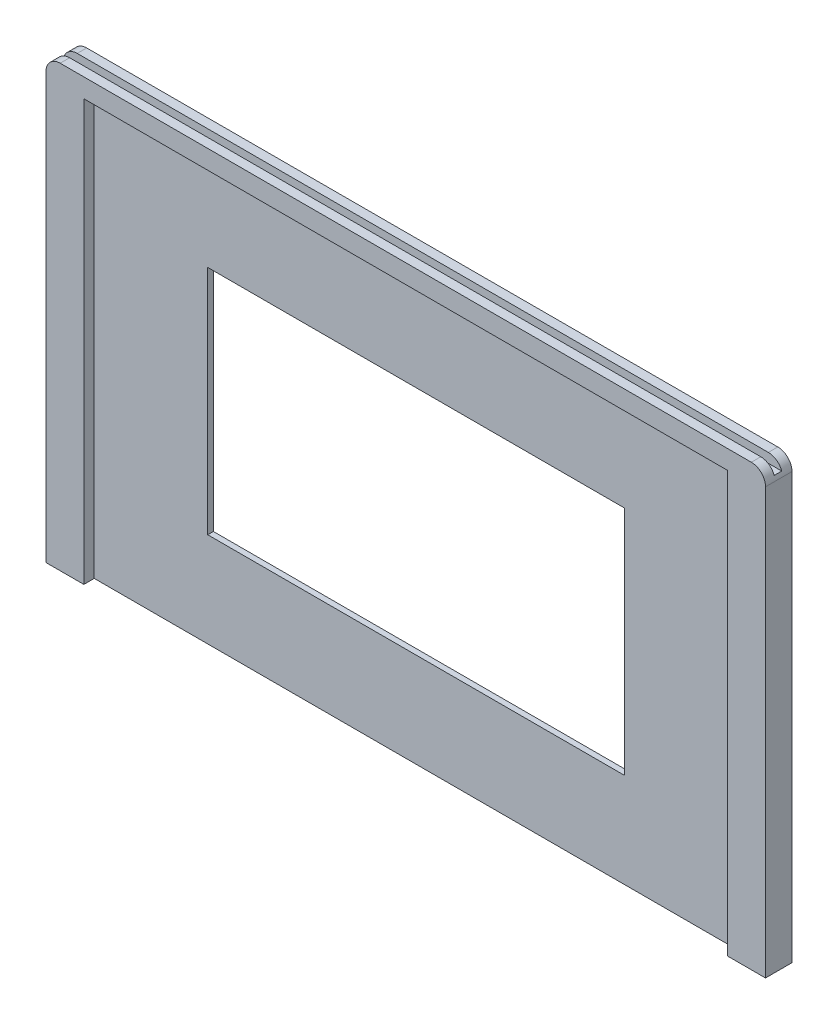
ISO-10303-21;
HEADER;
FILE_DESCRIPTION(('STEP AP214'),'2;1');
FILE_NAME('part.step','',(''),(''),'','','');
FILE_SCHEMA(('AUTOMOTIVE_DESIGN { 1 0 10303 214 1 1 1 1 }'));
ENDSEC;
DATA;
#1=APPLICATION_CONTEXT('core data for automotive mechanical design processes');
#2=APPLICATION_PROTOCOL_DEFINITION('international standard','automotive_design',2000,#1);
#3=PRODUCT_CONTEXT('',#1,'mechanical');
#4=PRODUCT('Part','Part','',(#3));
#5=PRODUCT_RELATED_PRODUCT_CATEGORY('part','',(#4));
#6=PRODUCT_DEFINITION_FORMATION('','',#4);
#7=PRODUCT_DEFINITION_CONTEXT('part definition',#1,'design');
#8=PRODUCT_DEFINITION('design','',#6,#7);
#9=PRODUCT_DEFINITION_SHAPE('','',#8);
#10=(LENGTH_UNIT() NAMED_UNIT(*) SI_UNIT(.MILLI.,.METRE.));
#11=(NAMED_UNIT(*) PLANE_ANGLE_UNIT() SI_UNIT($,.RADIAN.));
#12=(NAMED_UNIT(*) SI_UNIT($,.STERADIAN.) SOLID_ANGLE_UNIT());
#13=UNCERTAINTY_MEASURE_WITH_UNIT(LENGTH_MEASURE(1.E-05),#10,'distance_accuracy_value','');
#14=(GEOMETRIC_REPRESENTATION_CONTEXT(3) GLOBAL_UNCERTAINTY_ASSIGNED_CONTEXT((#13)) GLOBAL_UNIT_ASSIGNED_CONTEXT((#10,
#11,#12)) REPRESENTATION_CONTEXT('',''));
#15=CARTESIAN_POINT('',(0.,0.,0.));
#16=DIRECTION('',(0.,0.,1.));
#17=DIRECTION('',(1.,0.,0.));
#18=AXIS2_PLACEMENT_3D('',#15,#16,#17);
#19=CARTESIAN_POINT('',(-91.35,69.4698383459283,7.));
#20=DIRECTION('',(0.,-1.,0.));
#21=DIRECTION('',(1.,0.,0.));
#22=AXIS2_PLACEMENT_3D('',#19,#20,#21);
#23=PLANE('',#22);
#24=DIRECTION('',(0.,0.,-1.));
#25=VECTOR('',#24,1.);
#26=CARTESIAN_POINT('',(-91.35,69.4698383459283,7.));
#27=LINE('',#26,#25);
#28=CARTESIAN_POINT('',(-91.3499999999999,69.4698383459283,2.50000000000003));
#29=VERTEX_POINT('',#28);
#30=CARTESIAN_POINT('',(-91.35,69.4698383459283,0.));
#31=VERTEX_POINT('',#30);
#32=EDGE_CURVE('E390',#29,#31,#27,.T.);
#33=ORIENTED_EDGE('',*,*,#32,.F.);
#34=DIRECTION('',(-1.,0.,0.));
#35=VECTOR('',#34,1.);
#36=CARTESIAN_POINT('',(95.1,69.4698383459283,2.49999999999996));
#37=LINE('',#36,#35);
#38=CARTESIAN_POINT('',(91.35,69.4698383459283,2.49999999999997));
#39=VERTEX_POINT('',#38);
#40=EDGE_CURVE('E237',#39,#29,#37,.T.);
#41=ORIENTED_EDGE('',*,*,#40,.F.);
#42=DIRECTION('',(0.,0.,-1.));
#43=VECTOR('',#42,1.);
#44=CARTESIAN_POINT('',(91.35,69.4698383459283,7.));
#45=LINE('',#44,#43);
#46=CARTESIAN_POINT('',(91.35,69.4698383459283,0.));
#47=VERTEX_POINT('',#46);
#48=EDGE_CURVE('E395',#39,#47,#45,.T.);
#49=ORIENTED_EDGE('',*,*,#48,.T.);
#50=DIRECTION('',(-1.,0.,0.));
#51=VECTOR('',#50,1.);
#52=CARTESIAN_POINT('',(-91.35,69.4698383459283,0.));
#53=LINE('',#52,#51);
#54=EDGE_CURVE('E373',#47,#31,#53,.T.);
#55=ORIENTED_EDGE('',*,*,#54,.T.);
#56=EDGE_LOOP('',(#33,#41,#49,#55));
#57=FACE_BOUND('',#56,.T.);
#58=ADVANCED_FACE('F39',(#57),#23,.F.);
#59=CARTESIAN_POINT('',(-95.1,-46.7301616540717,7.));
#60=DIRECTION('',(0.,1.,0.));
#61=DIRECTION('',(-1.,0.,0.));
#62=AXIS2_PLACEMENT_3D('',#59,#60,#61);
#63=PLANE('',#62);
#64=DIRECTION('',(1.,0.,0.));
#65=VECTOR('',#64,1.);
#66=CARTESIAN_POINT('',(-85.1,-46.7301616540717,4.25));
#67=LINE('',#66,#65);
#68=CARTESIAN_POINT('',(-85.1,-46.7301616540717,4.25));
#69=VERTEX_POINT('',#68);
#70=CARTESIAN_POINT('',(85.1,-46.7301616540717,4.25));
#71=VERTEX_POINT('',#70);
#72=EDGE_CURVE('E262',#69,#71,#67,.T.);
#73=ORIENTED_EDGE('',*,*,#72,.F.);
#74=DIRECTION('',(0.,0.,1.));
#75=VECTOR('',#74,1.);
#76=CARTESIAN_POINT('',(-85.1,-46.7301616540717,4.25));
#77=LINE('',#76,#75);
#78=CARTESIAN_POINT('',(-85.1,-46.7301616540717,7.));
#79=VERTEX_POINT('',#78);
#80=EDGE_CURVE('E287',#69,#79,#77,.T.);
#81=ORIENTED_EDGE('',*,*,#80,.T.);
#82=DIRECTION('',(1.,0.,0.));
#83=VECTOR('',#82,1.);
#84=CARTESIAN_POINT('',(-95.1,-46.7301616540717,7.));
#85=LINE('',#84,#83);
#86=CARTESIAN_POINT('',(-95.1,-46.7301616540717,7.));
#87=VERTEX_POINT('',#86);
#88=EDGE_CURVE('E341',#87,#79,#85,.T.);
#89=ORIENTED_EDGE('',*,*,#88,.F.);
#90=DIRECTION('',(0.,0.,-1.));
#91=VECTOR('',#90,1.);
#92=CARTESIAN_POINT('',(-95.1,-46.7301616540717,7.));
#93=LINE('',#92,#91);
#94=CARTESIAN_POINT('',(-95.1,-46.7301616540717,0.));
#95=VERTEX_POINT('',#94);
#96=EDGE_CURVE('E361',#87,#95,#93,.T.);
#97=ORIENTED_EDGE('',*,*,#96,.T.);
#98=DIRECTION('',(1.,0.,0.));
#99=VECTOR('',#98,1.);
#100=CARTESIAN_POINT('',(-95.1,-46.7301616540717,0.));
#101=LINE('',#100,#99);
#102=CARTESIAN_POINT('',(-85.1,-46.7301616540717,0.));
#103=VERTEX_POINT('',#102);
#104=EDGE_CURVE('E362',#95,#103,#101,.T.);
#105=ORIENTED_EDGE('',*,*,#104,.T.);
#106=DIRECTION('',(0.,0.,-1.));
#107=VECTOR('',#106,1.);
#108=CARTESIAN_POINT('',(-85.1,-46.7301616540717,2.75));
#109=LINE('',#108,#107);
#110=CARTESIAN_POINT('',(-85.1,-46.7301616540717,2.75));
#111=VERTEX_POINT('',#110);
#112=EDGE_CURVE('E337',#111,#103,#109,.T.);
#113=ORIENTED_EDGE('',*,*,#112,.F.);
#114=DIRECTION('',(1.,0.,0.));
#115=VECTOR('',#114,1.);
#116=CARTESIAN_POINT('',(-85.1,-46.7301616540717,2.75));
#117=LINE('',#116,#115);
#118=CARTESIAN_POINT('',(85.1,-46.7301616540717,2.75));
#119=VERTEX_POINT('',#118);
#120=EDGE_CURVE('E304',#111,#119,#117,.T.);
#121=ORIENTED_EDGE('',*,*,#120,.T.);
#122=DIRECTION('',(0.,0.,-1.));
#123=VECTOR('',#122,1.);
#124=CARTESIAN_POINT('',(85.1,-46.7301616540717,2.75));
#125=LINE('',#124,#123);
#126=CARTESIAN_POINT('',(85.1,-46.7301616540717,0.));
#127=VERTEX_POINT('',#126);
#128=EDGE_CURVE('E333',#119,#127,#125,.T.);
#129=ORIENTED_EDGE('',*,*,#128,.T.);
#130=CARTESIAN_POINT('',(95.1,-46.7301616540717,0.));
#131=VERTEX_POINT('',#130);
#132=EDGE_CURVE('E340',#127,#131,#101,.T.);
#133=ORIENTED_EDGE('',*,*,#132,.T.);
#134=DIRECTION('',(0.,0.,-1.));
#135=VECTOR('',#134,1.);
#136=CARTESIAN_POINT('',(95.1,-46.7301616540717,7.));
#137=LINE('',#136,#135);
#138=CARTESIAN_POINT('',(95.1,-46.7301616540717,7.));
#139=VERTEX_POINT('',#138);
#140=EDGE_CURVE('E404',#139,#131,#137,.T.);
#141=ORIENTED_EDGE('',*,*,#140,.F.);
#142=CARTESIAN_POINT('',(85.0999999999998,-46.7301616540717,7.));
#143=VERTEX_POINT('',#142);
#144=EDGE_CURVE('E346',#143,#139,#85,.T.);
#145=ORIENTED_EDGE('',*,*,#144,.F.);
#146=DIRECTION('',(0.,0.,1.));
#147=VECTOR('',#146,1.);
#148=CARTESIAN_POINT('',(85.1,-46.7301616540717,4.25));
#149=LINE('',#148,#147);
#150=EDGE_CURVE('E277',#71,#143,#149,.T.);
#151=ORIENTED_EDGE('',*,*,#150,.F.);
#152=EDGE_LOOP('',(#73,#81,#89,#97,#105,#113,#121,#129,#133,#141,#145,#151));
#153=FACE_BOUND('',#152,.T.);
#154=ADVANCED_FACE('F41',(#153),#63,.F.);
#155=CARTESIAN_POINT('',(91.35,65.7198383459283,0.));
#156=DIRECTION('',(0.,0.,1.));
#157=DIRECTION('',(1.,0.,0.));
#158=AXIS2_PLACEMENT_3D('',#155,#156,#157);
#159=PLANE('',#158);
#160=DIRECTION('',(0.,1.,0.));
#161=VECTOR('',#160,1.);
#162=CARTESIAN_POINT('',(85.1,59.4698383459283,0.));
#163=LINE('',#162,#161);
#164=CARTESIAN_POINT('',(85.1,64.4698383459283,0.));
#165=VERTEX_POINT('',#164);
#166=EDGE_CURVE('E291',#127,#165,#163,.T.);
#167=ORIENTED_EDGE('',*,*,#166,.T.);
#168=DIRECTION('',(-1.,0.,0.));
#169=VECTOR('',#168,1.);
#170=CARTESIAN_POINT('',(-85.1,64.4698383459283,0.));
#171=LINE('',#170,#169);
#172=CARTESIAN_POINT('',(-85.1,64.4698383459283,0.));
#173=VERTEX_POINT('',#172);
#174=EDGE_CURVE('E320',#165,#173,#171,.T.);
#175=ORIENTED_EDGE('',*,*,#174,.T.);
#176=DIRECTION('',(0.,-1.,0.));
#177=VECTOR('',#176,1.);
#178=CARTESIAN_POINT('',(-85.1,59.4698383459283,0.));
#179=LINE('',#178,#177);
#180=EDGE_CURVE('E305',#173,#103,#179,.T.);
#181=ORIENTED_EDGE('',*,*,#180,.T.);
#182=ORIENTED_EDGE('',*,*,#104,.F.);
#183=DIRECTION('',(0.,-1.,0.));
#184=VECTOR('',#183,1.);
#185=CARTESIAN_POINT('',(-95.1,65.7198383459283,0.));
#186=LINE('',#185,#184);
#187=CARTESIAN_POINT('',(-95.1,65.7198383459283,0.));
#188=VERTEX_POINT('',#187);
#189=EDGE_CURVE('E380',#188,#95,#186,.T.);
#190=ORIENTED_EDGE('',*,*,#189,.F.);
#191=CARTESIAN_POINT('',(-91.35,65.7198383459283,0.));
#192=DIRECTION('',(0.,0.,1.));
#193=DIRECTION('',(1.,0.,0.));
#194=AXIS2_PLACEMENT_3D('',#191,#192,#193);
#195=CIRCLE('',#194,3.75000000000001);
#196=EDGE_CURVE('E377',#31,#188,#195,.T.);
#197=ORIENTED_EDGE('',*,*,#196,.F.);
#198=ORIENTED_EDGE('',*,*,#54,.F.);
#199=CARTESIAN_POINT('',(91.35,65.7198383459283,0.));
#200=DIRECTION('',(0.,0.,1.));
#201=DIRECTION('',(1.,0.,0.));
#202=AXIS2_PLACEMENT_3D('',#199,#200,#201);
#203=CIRCLE('',#202,3.75000000000002);
#204=CARTESIAN_POINT('',(95.1,65.7198383459283,0.));
#205=VERTEX_POINT('',#204);
#206=EDGE_CURVE('E369',#205,#47,#203,.T.);
#207=ORIENTED_EDGE('',*,*,#206,.F.);
#208=DIRECTION('',(0.,1.,0.));
#209=VECTOR('',#208,1.);
#210=CARTESIAN_POINT('',(95.1,65.7198383459283,0.));
#211=LINE('',#210,#209);
#212=EDGE_CURVE('E366',#131,#205,#211,.T.);
#213=ORIENTED_EDGE('',*,*,#212,.F.);
#214=ORIENTED_EDGE('',*,*,#132,.F.);
#215=EDGE_LOOP('',(#167,#175,#181,#182,#190,#197,#198,#207,#213,#214));
#216=FACE_BOUND('',#215,.T.);
#217=ADVANCED_FACE('F453',(#216),#159,.F.);
#218=CARTESIAN_POINT('',(95.1,65.7198383459283,7.));
#219=DIRECTION('',(-1.,0.,0.));
#220=DIRECTION('',(0.,-1.,0.));
#221=AXIS2_PLACEMENT_3D('',#218,#219,#220);
#222=PLANE('',#221);
#223=ORIENTED_EDGE('',*,*,#212,.T.);
#224=DIRECTION('',(0.,0.,-1.));
#225=VECTOR('',#224,1.);
#226=CARTESIAN_POINT('',(95.1,65.7198383459283,7.));
#227=LINE('',#226,#225);
#228=CARTESIAN_POINT('',(95.1,65.7198383459283,7.));
#229=VERTEX_POINT('',#228);
#230=EDGE_CURVE('E400',#229,#205,#227,.T.);
#231=ORIENTED_EDGE('',*,*,#230,.F.);
#232=DIRECTION('',(0.,1.,0.));
#233=VECTOR('',#232,1.);
#234=CARTESIAN_POINT('',(95.1,65.7198383459283,7.));
#235=LINE('',#234,#233);
#236=EDGE_CURVE('E345',#139,#229,#235,.T.);
#237=ORIENTED_EDGE('',*,*,#236,.F.);
#238=ORIENTED_EDGE('',*,*,#140,.T.);
#239=EDGE_LOOP('',(#223,#231,#237,#238));
#240=FACE_BOUND('',#239,.T.);
#241=ADVANCED_FACE('F457',(#240),#222,.F.);
#242=CARTESIAN_POINT('',(91.35,65.7198383459283,7.));
#243=DIRECTION('',(0.,0.,-1.));
#244=DIRECTION('',(-1.,0.,0.));
#245=AXIS2_PLACEMENT_3D('',#242,#243,#244);
#246=CYLINDRICAL_SURFACE('',#245,3.75000000000002);
#247=ORIENTED_EDGE('',*,*,#48,.F.);
#248=CARTESIAN_POINT('',(91.35,65.7198383459283,2.49999999999997));
#249=DIRECTION('',(0.,0.,-1.));
#250=DIRECTION('',(-1.,0.,0.));
#251=AXIS2_PLACEMENT_3D('',#248,#249,#250);
#252=CIRCLE('',#251,3.75000000000002);
#253=CARTESIAN_POINT('',(94.8855339059327,66.9698383459283,2.49999999999996));
#254=VERTEX_POINT('',#253);
#255=EDGE_CURVE('E257',#39,#254,#252,.T.);
#256=ORIENTED_EDGE('',*,*,#255,.T.);
#257=DIRECTION('',(0.,0.,-1.));
#258=VECTOR('',#257,1.);
#259=CARTESIAN_POINT('',(94.8855339059327,66.9698383459283,7.));
#260=LINE('',#259,#258);
#261=CARTESIAN_POINT('',(94.8855339059327,66.9698383459283,4.49999999999997));
#262=VERTEX_POINT('',#261);
#263=EDGE_CURVE('E246',#262,#254,#260,.T.);
#264=ORIENTED_EDGE('',*,*,#263,.F.);
#265=CARTESIAN_POINT('',(91.35,65.7198383459283,4.49999999999997));
#266=DIRECTION('',(0.,0.,1.));
#267=DIRECTION('',(1.,0.,0.));
#268=AXIS2_PLACEMENT_3D('',#265,#266,#267);
#269=CIRCLE('',#268,3.75000000000002);
#270=CARTESIAN_POINT('',(91.3499999999999,69.4698383459283,4.49999999999997));
#271=VERTEX_POINT('',#270);
#272=EDGE_CURVE('E253',#262,#271,#269,.T.);
#273=ORIENTED_EDGE('',*,*,#272,.T.);
#274=CARTESIAN_POINT('',(91.35,69.4698383459283,7.));
#275=VERTEX_POINT('',#274);
#276=EDGE_CURVE('E396',#275,#271,#45,.T.);
#277=ORIENTED_EDGE('',*,*,#276,.F.);
#278=CARTESIAN_POINT('',(91.35,65.7198383459283,7.));
#279=DIRECTION('',(0.,0.,1.));
#280=DIRECTION('',(1.,0.,0.));
#281=AXIS2_PLACEMENT_3D('',#278,#279,#280);
#282=CIRCLE('',#281,3.75000000000002);
#283=EDGE_CURVE('E349',#229,#275,#282,.T.);
#284=ORIENTED_EDGE('',*,*,#283,.F.);
#285=ORIENTED_EDGE('',*,*,#230,.T.);
#286=ORIENTED_EDGE('',*,*,#206,.T.);
#287=EDGE_LOOP('',(#247,#256,#264,#273,#277,#284,#285,#286));
#288=FACE_BOUND('',#287,.T.);
#289=ADVANCED_FACE('F428',(#288),#246,.T.);
#290=ORIENTED_EDGE('',*,*,#276,.T.);
#291=DIRECTION('',(1.,0.,0.));
#292=VECTOR('',#291,1.);
#293=CARTESIAN_POINT('',(-95.1,69.4698383459283,4.49999999999997));
#294=LINE('',#293,#292);
#295=CARTESIAN_POINT('',(-91.35,69.4698383459283,4.49999999999997));
#296=VERTEX_POINT('',#295);
#297=EDGE_CURVE('E242',#296,#271,#294,.T.);
#298=ORIENTED_EDGE('',*,*,#297,.F.);
#299=CARTESIAN_POINT('',(-91.35,69.4698383459283,7.));
#300=VERTEX_POINT('',#299);
#301=EDGE_CURVE('E391',#300,#296,#27,.T.);
#302=ORIENTED_EDGE('',*,*,#301,.F.);
#303=DIRECTION('',(-1.,0.,0.));
#304=VECTOR('',#303,1.);
#305=CARTESIAN_POINT('',(-91.35,69.4698383459283,7.));
#306=LINE('',#305,#304);
#307=EDGE_CURVE('E352',#275,#300,#306,.T.);
#308=ORIENTED_EDGE('',*,*,#307,.F.);
#309=EDGE_LOOP('',(#290,#298,#302,#308));
#310=FACE_BOUND('',#309,.T.);
#311=ADVANCED_FACE('F422',(#310),#23,.F.);
#312=CARTESIAN_POINT('',(-91.35,65.7198383459283,7.));
#313=DIRECTION('',(0.,0.,-1.));
#314=DIRECTION('',(-1.,0.,0.));
#315=AXIS2_PLACEMENT_3D('',#312,#313,#314);
#316=CYLINDRICAL_SURFACE('',#315,3.75000000000001);
#317=DIRECTION('',(0.,0.,-1.));
#318=VECTOR('',#317,1.);
#319=CARTESIAN_POINT('',(-94.8855339059327,66.9698383459283,7.));
#320=LINE('',#319,#318);
#321=CARTESIAN_POINT('',(-94.8855339059327,66.9698383459283,2.49999999999996));
#322=VERTEX_POINT('',#321);
#323=CARTESIAN_POINT('',(-94.8855339059327,66.9698383459283,4.49999999999997));
#324=VERTEX_POINT('',#323);
#325=EDGE_CURVE('E408',#322,#324,#320,.F.);
#326=ORIENTED_EDGE('',*,*,#325,.F.);
#327=CARTESIAN_POINT('',(-91.35,65.7198383459283,2.50000000000003));
#328=DIRECTION('',(0.,0.,-1.));
#329=DIRECTION('',(-1.,0.,0.));
#330=AXIS2_PLACEMENT_3D('',#327,#328,#329);
#331=CIRCLE('',#330,3.75000000000001);
#332=EDGE_CURVE('E11',#322,#29,#331,.T.);
#333=ORIENTED_EDGE('',*,*,#332,.T.);
#334=ORIENTED_EDGE('',*,*,#32,.T.);
#335=ORIENTED_EDGE('',*,*,#196,.T.);
#336=DIRECTION('',(0.,0.,-1.));
#337=VECTOR('',#336,1.);
#338=CARTESIAN_POINT('',(-95.1,65.7198383459283,7.));
#339=LINE('',#338,#337);
#340=CARTESIAN_POINT('',(-95.1,65.7198383459283,7.));
#341=VERTEX_POINT('',#340);
#342=EDGE_CURVE('E386',#341,#188,#339,.T.);
#343=ORIENTED_EDGE('',*,*,#342,.F.);
#344=CARTESIAN_POINT('',(-91.35,65.7198383459283,7.));
#345=DIRECTION('',(0.,0.,1.));
#346=DIRECTION('',(1.,0.,0.));
#347=AXIS2_PLACEMENT_3D('',#344,#345,#346);
#348=CIRCLE('',#347,3.75000000000001);
#349=EDGE_CURVE('E355',#300,#341,#348,.T.);
#350=ORIENTED_EDGE('',*,*,#349,.F.);
#351=ORIENTED_EDGE('',*,*,#301,.T.);
#352=CARTESIAN_POINT('',(-91.35,65.7198383459283,4.49999999999997));
#353=DIRECTION('',(0.,0.,1.));
#354=DIRECTION('',(1.,0.,0.));
#355=AXIS2_PLACEMENT_3D('',#352,#353,#354);
#356=CIRCLE('',#355,3.75000000000001);
#357=EDGE_CURVE('E48',#296,#324,#356,.T.);
#358=ORIENTED_EDGE('',*,*,#357,.T.);
#359=EDGE_LOOP('',(#326,#333,#334,#335,#343,#350,#351,#358));
#360=FACE_BOUND('',#359,.T.);
#361=ADVANCED_FACE('F414',(#360),#316,.T.);
#362=CARTESIAN_POINT('',(-95.1,65.7198383459283,7.));
#363=DIRECTION('',(1.,0.,0.));
#364=DIRECTION('',(0.,0.,-1.));
#365=AXIS2_PLACEMENT_3D('',#362,#363,#364);
#366=PLANE('',#365);
#367=ORIENTED_EDGE('',*,*,#189,.T.);
#368=ORIENTED_EDGE('',*,*,#96,.F.);
#369=DIRECTION('',(0.,-1.,0.));
#370=VECTOR('',#369,1.);
#371=CARTESIAN_POINT('',(-95.1,65.7198383459283,7.));
#372=LINE('',#371,#370);
#373=EDGE_CURVE('E358',#341,#87,#372,.T.);
#374=ORIENTED_EDGE('',*,*,#373,.F.);
#375=ORIENTED_EDGE('',*,*,#342,.T.);
#376=EDGE_LOOP('',(#367,#368,#374,#375));
#377=FACE_BOUND('',#376,.T.);
#378=ADVANCED_FACE('F477',(#377),#366,.F.);
#379=CARTESIAN_POINT('',(91.35,65.7198383459283,7.));
#380=DIRECTION('',(0.,0.,1.));
#381=DIRECTION('',(1.,0.,0.));
#382=AXIS2_PLACEMENT_3D('',#379,#380,#381);
#383=PLANE('',#382);
#384=DIRECTION('',(0.,-1.,0.));
#385=VECTOR('',#384,1.);
#386=CARTESIAN_POINT('',(-85.1,-36.7301616540717,7.));
#387=LINE('',#386,#385);
#388=CARTESIAN_POINT('',(-85.1,64.4698383459283,7.));
#389=VERTEX_POINT('',#388);
#390=EDGE_CURVE('E267',#389,#79,#387,.T.);
#391=ORIENTED_EDGE('',*,*,#390,.F.);
#392=DIRECTION('',(-1.,0.,0.));
#393=VECTOR('',#392,1.);
#394=CARTESIAN_POINT('',(-85.1,64.4698383459283,7.));
#395=LINE('',#394,#393);
#396=CARTESIAN_POINT('',(85.1,64.4698383459283,7.));
#397=VERTEX_POINT('',#396);
#398=EDGE_CURVE('E281',#397,#389,#395,.T.);
#399=ORIENTED_EDGE('',*,*,#398,.F.);
#400=DIRECTION('',(0.,1.,0.));
#401=VECTOR('',#400,1.);
#402=CARTESIAN_POINT('',(85.1,64.4698383459283,7.));
#403=LINE('',#402,#401);
#404=EDGE_CURVE('E261',#143,#397,#403,.T.);
#405=ORIENTED_EDGE('',*,*,#404,.F.);
#406=ORIENTED_EDGE('',*,*,#144,.T.);
#407=ORIENTED_EDGE('',*,*,#236,.T.);
#408=ORIENTED_EDGE('',*,*,#283,.T.);
#409=ORIENTED_EDGE('',*,*,#307,.T.);
#410=ORIENTED_EDGE('',*,*,#349,.T.);
#411=ORIENTED_EDGE('',*,*,#373,.T.);
#412=ORIENTED_EDGE('',*,*,#88,.T.);
#413=EDGE_LOOP('',(#391,#399,#405,#406,#407,#408,#409,#410,#411,#412));
#414=FACE_BOUND('',#413,.T.);
#415=ADVANCED_FACE('F460',(#414),#383,.T.);
#416=CARTESIAN_POINT('',(85.1,59.4698383459283,2.75));
#417=DIRECTION('',(-1.,0.,0.));
#418=DIRECTION('',(0.,-1.,0.));
#419=AXIS2_PLACEMENT_3D('',#416,#417,#418);
#420=PLANE('',#419);
#421=ORIENTED_EDGE('',*,*,#166,.F.);
#422=ORIENTED_EDGE('',*,*,#128,.F.);
#423=DIRECTION('',(0.,1.,0.));
#424=VECTOR('',#423,1.);
#425=CARTESIAN_POINT('',(85.1,-36.7301616540717,2.75));
#426=LINE('',#425,#424);
#427=CARTESIAN_POINT('',(85.1,64.4698383459283,2.75));
#428=VERTEX_POINT('',#427);
#429=EDGE_CURVE('E309',#119,#428,#426,.T.);
#430=ORIENTED_EDGE('',*,*,#429,.T.);
#431=DIRECTION('',(0.,0.,-1.));
#432=VECTOR('',#431,1.);
#433=CARTESIAN_POINT('',(85.1,64.4698383459283,2.75));
#434=LINE('',#433,#432);
#435=EDGE_CURVE('E330',#428,#165,#434,.T.);
#436=ORIENTED_EDGE('',*,*,#435,.T.);
#437=EDGE_LOOP('',(#421,#422,#430,#436));
#438=FACE_BOUND('',#437,.T.);
#439=ADVANCED_FACE('F493',(#438),#420,.T.);
#440=CARTESIAN_POINT('',(-85.1,64.4698383459283,2.75));
#441=DIRECTION('',(0.,-1.,0.));
#442=DIRECTION('',(0.,0.,-1.));
#443=AXIS2_PLACEMENT_3D('',#440,#441,#442);
#444=PLANE('',#443);
#445=ORIENTED_EDGE('',*,*,#174,.F.);
#446=ORIENTED_EDGE('',*,*,#435,.F.);
#447=DIRECTION('',(-1.,0.,0.));
#448=VECTOR('',#447,1.);
#449=CARTESIAN_POINT('',(-85.1,64.4698383459283,2.75));
#450=LINE('',#449,#448);
#451=CARTESIAN_POINT('',(-85.1,64.4698383459283,2.75));
#452=VERTEX_POINT('',#451);
#453=EDGE_CURVE('E312',#428,#452,#450,.T.);
#454=ORIENTED_EDGE('',*,*,#453,.T.);
#455=DIRECTION('',(0.,0.,-1.));
#456=VECTOR('',#455,1.);
#457=CARTESIAN_POINT('',(-85.1,64.4698383459283,2.75));
#458=LINE('',#457,#456);
#459=EDGE_CURVE('E316',#452,#173,#458,.T.);
#460=ORIENTED_EDGE('',*,*,#459,.T.);
#461=EDGE_LOOP('',(#445,#446,#454,#460));
#462=FACE_BOUND('',#461,.T.);
#463=ADVANCED_FACE('F486',(#462),#444,.T.);
#464=CARTESIAN_POINT('',(-85.1,59.4698383459283,2.75));
#465=DIRECTION('',(1.,0.,0.));
#466=DIRECTION('',(0.,0.,-1.));
#467=AXIS2_PLACEMENT_3D('',#464,#465,#466);
#468=PLANE('',#467);
#469=ORIENTED_EDGE('',*,*,#180,.F.);
#470=ORIENTED_EDGE('',*,*,#459,.F.);
#471=DIRECTION('',(0.,-1.,0.));
#472=VECTOR('',#471,1.);
#473=CARTESIAN_POINT('',(-85.1,-36.7301616540717,2.75));
#474=LINE('',#473,#472);
#475=EDGE_CURVE('E300',#452,#111,#474,.T.);
#476=ORIENTED_EDGE('',*,*,#475,.T.);
#477=ORIENTED_EDGE('',*,*,#112,.T.);
#478=EDGE_LOOP('',(#469,#470,#476,#477));
#479=FACE_BOUND('',#478,.T.);
#480=ADVANCED_FACE('F484',(#479),#468,.T.);
#481=CARTESIAN_POINT('',(0.,0.,2.75));
#482=DIRECTION('',(0.,0.,1.));
#483=DIRECTION('',(1.,0.,0.));
#484=AXIS2_PLACEMENT_3D('',#481,#482,#483);
#485=PLANE('',#484);
#486=DIRECTION('',(-1.,0.,0.));
#487=VECTOR('',#486,1.);
#488=CARTESIAN_POINT('',(0.,39.4698383459283,2.75));
#489=LINE('',#488,#487);
#490=CARTESIAN_POINT('',(55.1,39.4698383459283,2.75));
#491=VERTEX_POINT('',#490);
#492=CARTESIAN_POINT('',(-55.1,39.4698383459283,2.75));
#493=VERTEX_POINT('',#492);
#494=EDGE_CURVE('E229',#491,#493,#489,.T.);
#495=ORIENTED_EDGE('',*,*,#494,.T.);
#496=DIRECTION('',(0.,-1.,0.));
#497=VECTOR('',#496,1.);
#498=CARTESIAN_POINT('',(-55.1,0.,2.75));
#499=LINE('',#498,#497);
#500=CARTESIAN_POINT('',(-55.1,-21.7301616540717,2.75));
#501=VERTEX_POINT('',#500);
#502=EDGE_CURVE('E233',#493,#501,#499,.T.);
#503=ORIENTED_EDGE('',*,*,#502,.T.);
#504=DIRECTION('',(1.,0.,0.));
#505=VECTOR('',#504,1.);
#506=CARTESIAN_POINT('',(0.,-21.7301616540717,2.75));
#507=LINE('',#506,#505);
#508=CARTESIAN_POINT('',(55.1,-21.7301616540717,2.75));
#509=VERTEX_POINT('',#508);
#510=EDGE_CURVE('E220',#501,#509,#507,.T.);
#511=ORIENTED_EDGE('',*,*,#510,.T.);
#512=DIRECTION('',(0.,1.,0.));
#513=VECTOR('',#512,1.);
#514=CARTESIAN_POINT('',(55.1,0.,2.75));
#515=LINE('',#514,#513);
#516=EDGE_CURVE('E195',#509,#491,#515,.T.);
#517=ORIENTED_EDGE('',*,*,#516,.T.);
#518=EDGE_LOOP('',(#495,#503,#511,#517));
#519=FACE_BOUND('',#518,.T.);
#520=ORIENTED_EDGE('',*,*,#475,.F.);
#521=ORIENTED_EDGE('',*,*,#453,.F.);
#522=ORIENTED_EDGE('',*,*,#429,.F.);
#523=ORIENTED_EDGE('',*,*,#120,.F.);
#524=EDGE_LOOP('',(#520,#521,#522,#523));
#525=FACE_BOUND('',#524,.T.);
#526=ADVANCED_FACE('F491',(#519,#525),#485,.F.);
#527=CARTESIAN_POINT('',(-85.1,-36.7301616540717,4.25));
#528=DIRECTION('',(-1.,0.,0.));
#529=DIRECTION('',(0.,-1.,0.));
#530=AXIS2_PLACEMENT_3D('',#527,#528,#529);
#531=PLANE('',#530);
#532=ORIENTED_EDGE('',*,*,#390,.T.);
#533=ORIENTED_EDGE('',*,*,#80,.F.);
#534=DIRECTION('',(0.,-1.,0.));
#535=VECTOR('',#534,1.);
#536=CARTESIAN_POINT('',(-85.1,59.4698383459283,4.25));
#537=LINE('',#536,#535);
#538=CARTESIAN_POINT('',(-85.1,64.4698383459283,4.25));
#539=VERTEX_POINT('',#538);
#540=EDGE_CURVE('E274',#539,#69,#537,.T.);
#541=ORIENTED_EDGE('',*,*,#540,.F.);
#542=DIRECTION('',(0.,0.,1.));
#543=VECTOR('',#542,1.);
#544=CARTESIAN_POINT('',(-85.1,64.4698383459283,4.25));
#545=LINE('',#544,#543);
#546=EDGE_CURVE('E292',#539,#389,#545,.T.);
#547=ORIENTED_EDGE('',*,*,#546,.T.);
#548=EDGE_LOOP('',(#532,#533,#541,#547));
#549=FACE_BOUND('',#548,.T.);
#550=ADVANCED_FACE('F471',(#549),#531,.F.);
#551=CARTESIAN_POINT('',(-85.1,64.4698383459283,4.25));
#552=DIRECTION('',(0.,1.,0.));
#553=DIRECTION('',(0.,0.,1.));
#554=AXIS2_PLACEMENT_3D('',#551,#552,#553);
#555=PLANE('',#554);
#556=ORIENTED_EDGE('',*,*,#398,.T.);
#557=ORIENTED_EDGE('',*,*,#546,.F.);
#558=DIRECTION('',(-1.,0.,0.));
#559=VECTOR('',#558,1.);
#560=CARTESIAN_POINT('',(-85.1,64.4698383459283,4.25));
#561=LINE('',#560,#559);
#562=CARTESIAN_POINT('',(85.1,64.4698383459283,4.25));
#563=VERTEX_POINT('',#562);
#564=EDGE_CURVE('E270',#563,#539,#561,.T.);
#565=ORIENTED_EDGE('',*,*,#564,.F.);
#566=DIRECTION('',(0.,0.,1.));
#567=VECTOR('',#566,1.);
#568=CARTESIAN_POINT('',(85.1,64.4698383459283,4.25));
#569=LINE('',#568,#567);
#570=EDGE_CURVE('E295',#563,#397,#569,.T.);
#571=ORIENTED_EDGE('',*,*,#570,.T.);
#572=EDGE_LOOP('',(#556,#557,#565,#571));
#573=FACE_BOUND('',#572,.T.);
#574=ADVANCED_FACE('F547',(#573),#555,.F.);
#575=CARTESIAN_POINT('',(85.1,64.4698383459283,4.25));
#576=DIRECTION('',(1.,0.,0.));
#577=DIRECTION('',(0.,1.,0.));
#578=AXIS2_PLACEMENT_3D('',#575,#576,#577);
#579=PLANE('',#578);
#580=ORIENTED_EDGE('',*,*,#404,.T.);
#581=ORIENTED_EDGE('',*,*,#570,.F.);
#582=DIRECTION('',(0.,1.,0.));
#583=VECTOR('',#582,1.);
#584=CARTESIAN_POINT('',(85.1,-36.7301616540717,4.25));
#585=LINE('',#584,#583);
#586=EDGE_CURVE('E266',#71,#563,#585,.T.);
#587=ORIENTED_EDGE('',*,*,#586,.F.);
#588=ORIENTED_EDGE('',*,*,#150,.T.);
#589=EDGE_LOOP('',(#580,#581,#587,#588));
#590=FACE_BOUND('',#589,.T.);
#591=ADVANCED_FACE('F465',(#590),#579,.F.);
#592=CARTESIAN_POINT('',(0.,0.,4.25));
#593=DIRECTION('',(0.,0.,-1.));
#594=DIRECTION('',(-1.,0.,0.));
#595=AXIS2_PLACEMENT_3D('',#592,#593,#594);
#596=PLANE('',#595);
#597=DIRECTION('',(1.,0.,0.));
#598=VECTOR('',#597,1.);
#599=CARTESIAN_POINT('',(55.1,-21.7301616540717,4.25));
#600=LINE('',#599,#598);
#601=CARTESIAN_POINT('',(-55.1,-21.7301616540717,4.25));
#602=VERTEX_POINT('',#601);
#603=CARTESIAN_POINT('',(55.1,-21.7301616540717,4.25));
#604=VERTEX_POINT('',#603);
#605=EDGE_CURVE('E202',#602,#604,#600,.T.);
#606=ORIENTED_EDGE('',*,*,#605,.F.);
#607=DIRECTION('',(0.,-1.,0.));
#608=VECTOR('',#607,1.);
#609=CARTESIAN_POINT('',(-55.1,-21.7301616540717,4.25));
#610=LINE('',#609,#608);
#611=CARTESIAN_POINT('',(-55.1,39.4698383459283,4.25));
#612=VERTEX_POINT('',#611);
#613=EDGE_CURVE('E63',#612,#602,#610,.T.);
#614=ORIENTED_EDGE('',*,*,#613,.F.);
#615=DIRECTION('',(-1.,0.,0.));
#616=VECTOR('',#615,1.);
#617=CARTESIAN_POINT('',(-55.1,39.4698383459283,4.25));
#618=LINE('',#617,#616);
#619=CARTESIAN_POINT('',(55.1,39.4698383459283,4.25));
#620=VERTEX_POINT('',#619);
#621=EDGE_CURVE('E210',#620,#612,#618,.T.);
#622=ORIENTED_EDGE('',*,*,#621,.F.);
#623=DIRECTION('',(0.,1.,0.));
#624=VECTOR('',#623,1.);
#625=CARTESIAN_POINT('',(55.1,39.4698383459283,4.25));
#626=LINE('',#625,#624);
#627=EDGE_CURVE('E192',#604,#620,#626,.T.);
#628=ORIENTED_EDGE('',*,*,#627,.F.);
#629=EDGE_LOOP('',(#606,#614,#622,#628));
#630=FACE_BOUND('',#629,.T.);
#631=ORIENTED_EDGE('',*,*,#72,.T.);
#632=ORIENTED_EDGE('',*,*,#586,.T.);
#633=ORIENTED_EDGE('',*,*,#564,.T.);
#634=ORIENTED_EDGE('',*,*,#540,.T.);
#635=EDGE_LOOP('',(#631,#632,#633,#634));
#636=FACE_BOUND('',#635,.T.);
#637=ADVANCED_FACE('F207',(#630,#636),#596,.F.);
#638=CARTESIAN_POINT('',(95.1,66.9698383459283,2.49999999999996));
#639=DIRECTION('',(0.,0.,-1.));
#640=DIRECTION('',(-1.,0.,0.));
#641=AXIS2_PLACEMENT_3D('',#638,#639,#640);
#642=PLANE('',#641);
#643=ORIENTED_EDGE('',*,*,#40,.T.);
#644=ORIENTED_EDGE('',*,*,#332,.F.);
#645=DIRECTION('',(-1.,0.,0.));
#646=VECTOR('',#645,1.);
#647=CARTESIAN_POINT('',(95.1,66.9698383459283,2.49999999999996));
#648=LINE('',#647,#646);
#649=EDGE_CURVE('E238',#254,#322,#648,.T.);
#650=ORIENTED_EDGE('',*,*,#649,.F.);
#651=ORIENTED_EDGE('',*,*,#255,.F.);
#652=EDGE_LOOP('',(#643,#644,#650,#651));
#653=FACE_BOUND('',#652,.T.);
#654=ADVANCED_FACE('F435',(#653),#642,.F.);
#655=CARTESIAN_POINT('',(-95.1,66.9698383459283,4.49999999999997));
#656=DIRECTION('',(0.,0.,1.));
#657=DIRECTION('',(1.,0.,0.));
#658=AXIS2_PLACEMENT_3D('',#655,#656,#657);
#659=PLANE('',#658);
#660=DIRECTION('',(1.,0.,0.));
#661=VECTOR('',#660,1.);
#662=CARTESIAN_POINT('',(-95.1,66.9698383459283,4.49999999999997));
#663=LINE('',#662,#661);
#664=EDGE_CURVE('E241',#324,#262,#663,.T.);
#665=ORIENTED_EDGE('',*,*,#664,.F.);
#666=ORIENTED_EDGE('',*,*,#357,.F.);
#667=ORIENTED_EDGE('',*,*,#297,.T.);
#668=ORIENTED_EDGE('',*,*,#272,.F.);
#669=EDGE_LOOP('',(#665,#666,#667,#668));
#670=FACE_BOUND('',#669,.T.);
#671=ADVANCED_FACE('F420',(#670),#659,.F.);
#672=CARTESIAN_POINT('',(0.,66.9698383459283,0.));
#673=DIRECTION('',(0.,1.,0.));
#674=DIRECTION('',(0.,0.,1.));
#675=AXIS2_PLACEMENT_3D('',#672,#673,#674);
#676=PLANE('',#675);
#677=ORIENTED_EDGE('',*,*,#263,.T.);
#678=ORIENTED_EDGE('',*,*,#649,.T.);
#679=ORIENTED_EDGE('',*,*,#325,.T.);
#680=ORIENTED_EDGE('',*,*,#664,.T.);
#681=EDGE_LOOP('',(#677,#678,#679,#680));
#682=FACE_BOUND('',#681,.T.);
#683=ADVANCED_FACE('F431',(#682),#676,.T.);
#684=CARTESIAN_POINT('',(-55.1,-21.7301616540717,0.));
#685=DIRECTION('',(-1.,0.,0.));
#686=DIRECTION('',(0.,-1.,0.));
#687=AXIS2_PLACEMENT_3D('',#684,#685,#686);
#688=PLANE('',#687);
#689=DIRECTION('',(0.,0.,1.));
#690=VECTOR('',#689,1.);
#691=CARTESIAN_POINT('',(-55.1,39.4698383459283,0.));
#692=LINE('',#691,#690);
#693=EDGE_CURVE('E217',#493,#612,#692,.T.);
#694=ORIENTED_EDGE('',*,*,#693,.T.);
#695=ORIENTED_EDGE('',*,*,#613,.T.);
#696=DIRECTION('',(0.,0.,1.));
#697=VECTOR('',#696,1.);
#698=CARTESIAN_POINT('',(-55.1,-21.7301616540717,0.));
#699=LINE('',#698,#697);
#700=EDGE_CURVE('E199',#501,#602,#699,.T.);
#701=ORIENTED_EDGE('',*,*,#700,.F.);
#702=ORIENTED_EDGE('',*,*,#502,.F.);
#703=EDGE_LOOP('',(#694,#695,#701,#702));
#704=FACE_BOUND('',#703,.T.);
#705=ADVANCED_FACE('F612',(#704),#688,.F.);
#706=CARTESIAN_POINT('',(-55.1,39.4698383459283,0.));
#707=DIRECTION('',(0.,1.,0.));
#708=DIRECTION('',(0.,0.,1.));
#709=AXIS2_PLACEMENT_3D('',#706,#707,#708);
#710=PLANE('',#709);
#711=DIRECTION('',(0.,0.,1.));
#712=VECTOR('',#711,1.);
#713=CARTESIAN_POINT('',(55.1,39.4698383459283,0.));
#714=LINE('',#713,#712);
#715=EDGE_CURVE('E198',#491,#620,#714,.T.);
#716=ORIENTED_EDGE('',*,*,#715,.T.);
#717=ORIENTED_EDGE('',*,*,#621,.T.);
#718=ORIENTED_EDGE('',*,*,#693,.F.);
#719=ORIENTED_EDGE('',*,*,#494,.F.);
#720=EDGE_LOOP('',(#716,#717,#718,#719));
#721=FACE_BOUND('',#720,.T.);
#722=ADVANCED_FACE('F638',(#721),#710,.F.);
#723=CARTESIAN_POINT('',(55.1,39.4698383459283,0.));
#724=DIRECTION('',(1.,0.,0.));
#725=DIRECTION('',(0.,1.,0.));
#726=AXIS2_PLACEMENT_3D('',#723,#724,#725);
#727=PLANE('',#726);
#728=DIRECTION('',(0.,0.,1.));
#729=VECTOR('',#728,1.);
#730=CARTESIAN_POINT('',(55.1,-21.7301616540717,0.));
#731=LINE('',#730,#729);
#732=EDGE_CURVE('E55',#509,#604,#731,.T.);
#733=ORIENTED_EDGE('',*,*,#732,.T.);
#734=ORIENTED_EDGE('',*,*,#627,.T.);
#735=ORIENTED_EDGE('',*,*,#715,.F.);
#736=ORIENTED_EDGE('',*,*,#516,.F.);
#737=EDGE_LOOP('',(#733,#734,#735,#736));
#738=FACE_BOUND('',#737,.T.);
#739=ADVANCED_FACE('F189',(#738),#727,.F.);
#740=CARTESIAN_POINT('',(55.1,-21.7301616540717,0.));
#741=DIRECTION('',(0.,-1.,0.));
#742=DIRECTION('',(1.,0.,0.));
#743=AXIS2_PLACEMENT_3D('',#740,#741,#742);
#744=PLANE('',#743);
#745=ORIENTED_EDGE('',*,*,#700,.T.);
#746=ORIENTED_EDGE('',*,*,#605,.T.);
#747=ORIENTED_EDGE('',*,*,#732,.F.);
#748=ORIENTED_EDGE('',*,*,#510,.F.);
#749=EDGE_LOOP('',(#745,#746,#747,#748));
#750=FACE_BOUND('',#749,.T.);
#751=ADVANCED_FACE('F203',(#750),#744,.F.);
#752=CLOSED_SHELL('',(#58,#154,#217,#241,#289,#311,#361,#378,#415,#439,#463,#480,#526,#550,#574,
#591,#637,#654,#671,#683,#705,#722,#739,#751));
#753=MANIFOLD_SOLID_BREP('B2',#752);
#754=ADVANCED_BREP_SHAPE_REPRESENTATION('',(#18,#753),#14);
#755=SHAPE_DEFINITION_REPRESENTATION(#9,#754);
ENDSEC;
END-ISO-10303-21;
